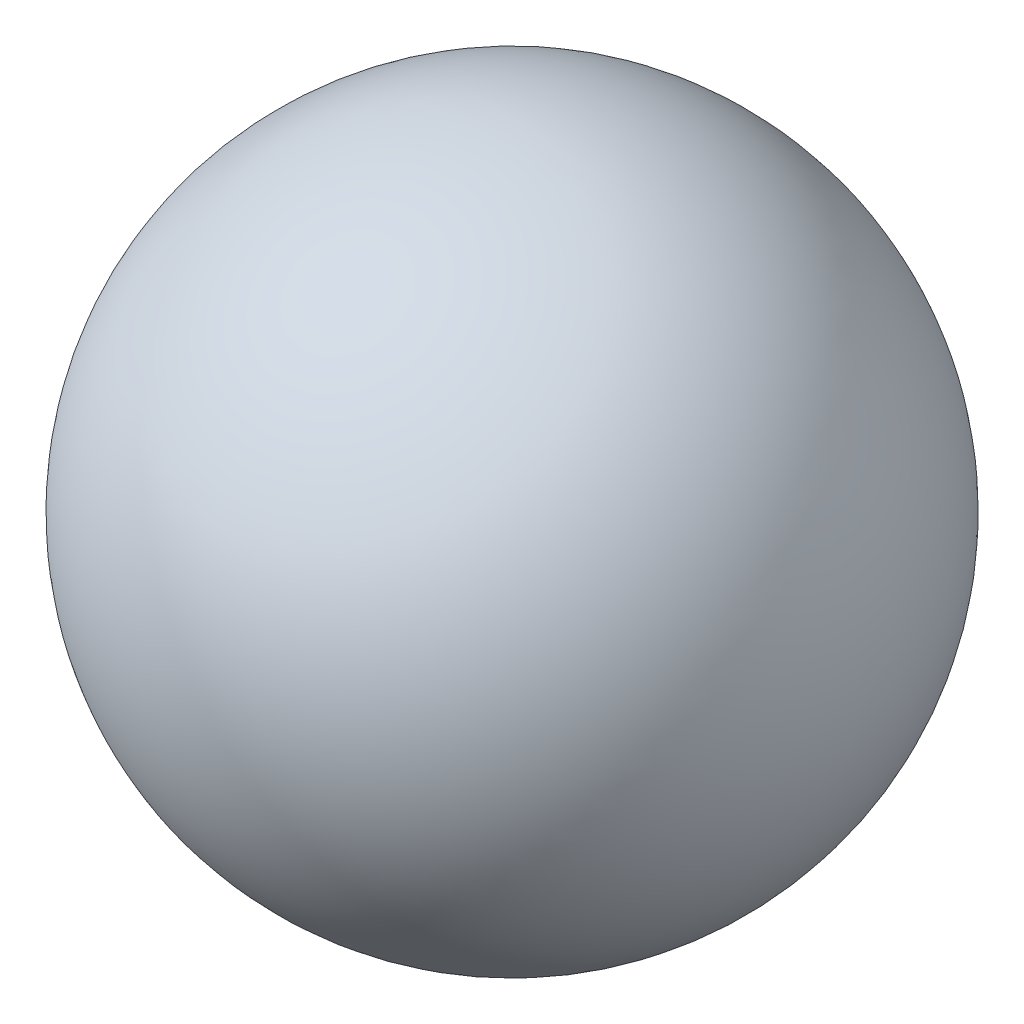
ISO-10303-21;
HEADER;
FILE_DESCRIPTION(('STEP AP214'),'2;1');
FILE_NAME('part.step','',(''),(''),'','','');
FILE_SCHEMA(('AUTOMOTIVE_DESIGN { 1 0 10303 214 1 1 1 1 }'));
ENDSEC;
DATA;
#1=APPLICATION_CONTEXT('core data for automotive mechanical design processes');
#2=APPLICATION_PROTOCOL_DEFINITION('international standard','automotive_design',2000,#1);
#3=PRODUCT_CONTEXT('',#1,'mechanical');
#4=PRODUCT('Part','Part','',(#3));
#5=PRODUCT_RELATED_PRODUCT_CATEGORY('part','',(#4));
#6=PRODUCT_DEFINITION_FORMATION('','',#4);
#7=PRODUCT_DEFINITION_CONTEXT('part definition',#1,'design');
#8=PRODUCT_DEFINITION('design','',#6,#7);
#9=PRODUCT_DEFINITION_SHAPE('','',#8);
#10=(LENGTH_UNIT() NAMED_UNIT(*) SI_UNIT(.MILLI.,.METRE.));
#11=(NAMED_UNIT(*) PLANE_ANGLE_UNIT() SI_UNIT($,.RADIAN.));
#12=(NAMED_UNIT(*) SI_UNIT($,.STERADIAN.) SOLID_ANGLE_UNIT());
#13=UNCERTAINTY_MEASURE_WITH_UNIT(LENGTH_MEASURE(1.E-05),#10,'distance_accuracy_value','');
#14=(GEOMETRIC_REPRESENTATION_CONTEXT(3) GLOBAL_UNCERTAINTY_ASSIGNED_CONTEXT((#13)) GLOBAL_UNIT_ASSIGNED_CONTEXT((#10,
#11,#12)) REPRESENTATION_CONTEXT('',''));
#15=CARTESIAN_POINT('',(0.,0.,0.));
#16=DIRECTION('',(0.,0.,1.));
#17=DIRECTION('',(1.,0.,0.));
#18=AXIS2_PLACEMENT_3D('',#15,#16,#17);
#19=CARTESIAN_POINT('',(0.,0.,0.));
#20=DIRECTION('',(0.,0.,1.));
#21=DIRECTION('',(-1.,0.,0.));
#22=AXIS2_PLACEMENT_3D('',#19,#20,#21);
#23=SPHERICAL_SURFACE('',#22,46.);
#24=CARTESIAN_POINT('',(0.,0.,46.));
#25=VERTEX_POINT('',#24);
#26=VERTEX_LOOP('',#25);
#27=FACE_BOUND('',#26,.T.);
#28=ADVANCED_FACE('F30',(#27),#23,.T.);
#29=CLOSED_SHELL('',(#28));
#30=CARTESIAN_POINT('',(0.,0.,0.));
#31=DIRECTION('',(0.,0.,1.));
#32=DIRECTION('',(-1.,0.,0.));
#33=AXIS2_PLACEMENT_3D('',#30,#31,#32);
#34=SPHERICAL_SURFACE('',#33,43.5);
#35=CARTESIAN_POINT('',(0.,0.,43.5));
#36=VERTEX_POINT('',#35);
#37=VERTEX_LOOP('',#36);
#38=FACE_BOUND('',#37,.T.);
#39=ADVANCED_FACE('F32',(#38),#34,.F.);
#40=CLOSED_SHELL('',(#39));
#41=ORIENTED_CLOSED_SHELL('',*,#40,.T.);
#42=BREP_WITH_VOIDS('B2',#29,(#41));
#43=ADVANCED_BREP_SHAPE_REPRESENTATION('',(#18,#42),#14);
#44=SHAPE_DEFINITION_REPRESENTATION(#9,#43);
ENDSEC;
END-ISO-10303-21;
